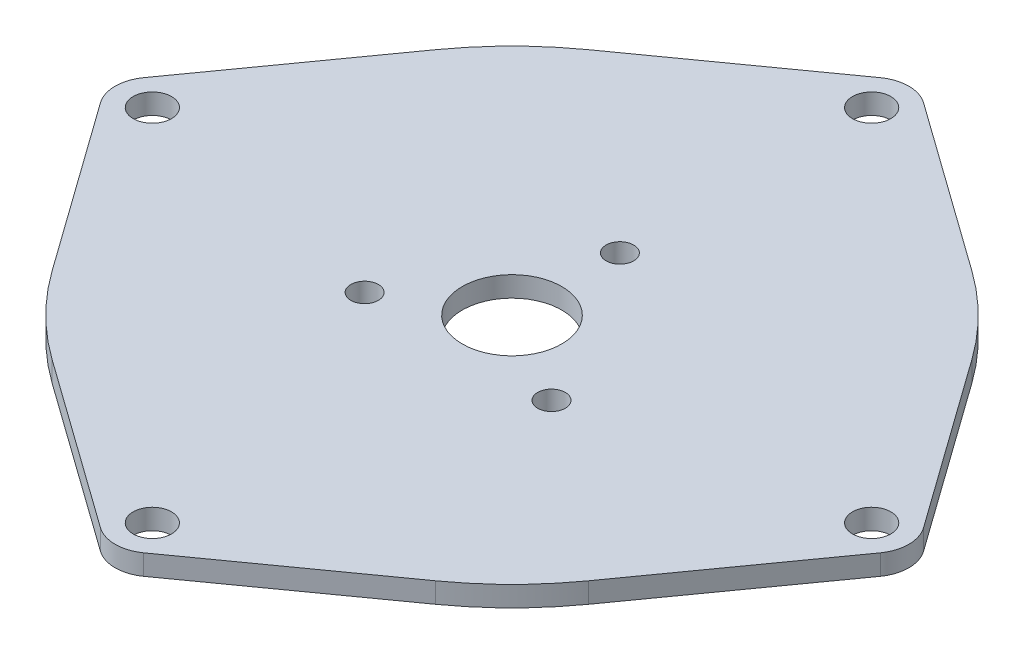
ISO-10303-21;
HEADER;
FILE_DESCRIPTION(('STEP AP214'),'2;1');
FILE_NAME('part.step','',(''),(''),'','','');
FILE_SCHEMA(('AUTOMOTIVE_DESIGN { 1 0 10303 214 1 1 1 1 }'));
ENDSEC;
DATA;
#1=APPLICATION_CONTEXT('core data for automotive mechanical design processes');
#2=APPLICATION_PROTOCOL_DEFINITION('international standard','automotive_design',2000,#1);
#3=PRODUCT_CONTEXT('',#1,'mechanical');
#4=PRODUCT('Part','Part','',(#3));
#5=PRODUCT_RELATED_PRODUCT_CATEGORY('part','',(#4));
#6=PRODUCT_DEFINITION_FORMATION('','',#4);
#7=PRODUCT_DEFINITION_CONTEXT('part definition',#1,'design');
#8=PRODUCT_DEFINITION('design','',#6,#7);
#9=PRODUCT_DEFINITION_SHAPE('','',#8);
#10=(LENGTH_UNIT() NAMED_UNIT(*) SI_UNIT(.MILLI.,.METRE.));
#11=(NAMED_UNIT(*) PLANE_ANGLE_UNIT() SI_UNIT($,.RADIAN.));
#12=(NAMED_UNIT(*) SI_UNIT($,.STERADIAN.) SOLID_ANGLE_UNIT());
#13=UNCERTAINTY_MEASURE_WITH_UNIT(LENGTH_MEASURE(1.E-05),#10,'distance_accuracy_value','');
#14=(GEOMETRIC_REPRESENTATION_CONTEXT(3) GLOBAL_UNCERTAINTY_ASSIGNED_CONTEXT((#13)) GLOBAL_UNIT_ASSIGNED_CONTEXT((#10,
#11,#12)) REPRESENTATION_CONTEXT('',''));
#15=CARTESIAN_POINT('',(0.,0.,0.));
#16=DIRECTION('',(0.,0.,1.));
#17=DIRECTION('',(1.,0.,0.));
#18=AXIS2_PLACEMENT_3D('',#15,#16,#17);
#19=CARTESIAN_POINT('',(15.9994444347971,1.7,-22.3666666666639));
#20=DIRECTION('',(0.581797979447238,0.,-0.813333333333334));
#21=DIRECTION('',(-0.813333333333334,0.,-0.581797979447238));
#22=AXIS2_PLACEMENT_3D('',#19,#20,#21);
#23=PLANE('',#22);
#24=DIRECTION('',(0.813333333333334,0.,0.581797979447238));
#25=VECTOR('',#24,1.);
#26=CARTESIAN_POINT('',(15.9994444347971,0.,-22.3666666666639));
#27=LINE('',#26,#25);
#28=CARTESIAN_POINT('',(1.8035737362858,0.,-32.5213333333296));
#29=VERTEX_POINT('',#28);
#30=CARTESIAN_POINT('',(15.9994444347994,0.,-22.3666666666643));
#31=VERTEX_POINT('',#30);
#32=EDGE_CURVE('E264',#29,#31,#27,.T.);
#33=ORIENTED_EDGE('',*,*,#32,.F.);
#34=DIRECTION('',(0.,-1.,0.));
#35=VECTOR('',#34,1.);
#36=CARTESIAN_POINT('',(1.8035737362858,1.7,-32.5213333333296));
#37=LINE('',#36,#35);
#38=CARTESIAN_POINT('',(1.8035737362858,1.7,-32.5213333333296));
#39=VERTEX_POINT('',#38);
#40=EDGE_CURVE('E11',#39,#29,#37,.T.);
#41=ORIENTED_EDGE('',*,*,#40,.F.);
#42=DIRECTION('',(0.813333333333334,0.,0.581797979447238));
#43=VECTOR('',#42,1.);
#44=CARTESIAN_POINT('',(15.9994444347971,1.7,-22.3666666666639));
#45=LINE('',#44,#43);
#46=CARTESIAN_POINT('',(15.9994444347994,1.7,-22.3666666666643));
#47=VERTEX_POINT('',#46);
#48=EDGE_CURVE('E410',#39,#47,#45,.T.);
#49=ORIENTED_EDGE('',*,*,#48,.T.);
#50=DIRECTION('',(0.,-1.,0.));
#51=VECTOR('',#50,1.);
#52=CARTESIAN_POINT('',(15.9994444347994,1.7,-22.3666666666643));
#53=LINE('',#52,#51);
#54=EDGE_CURVE('E145',#47,#31,#53,.T.);
#55=ORIENTED_EDGE('',*,*,#54,.T.);
#56=EDGE_LOOP('',(#33,#41,#49,#55));
#57=FACE_BOUND('',#56,.T.);
#58=ADVANCED_FACE('F51',(#57),#23,.T.);
#59=CARTESIAN_POINT('',(-6.33480808899767E-13,1.7,-29.9999999999963));
#60=DIRECTION('',(0.,-1.,0.));
#61=DIRECTION('',(0.,0.,-1.));
#62=AXIS2_PLACEMENT_3D('',#59,#60,#61);
#63=CYLINDRICAL_SURFACE('',#62,3.1);
#64=CARTESIAN_POINT('',(-6.33480808899767E-13,0.,-29.9999999999963));
#65=DIRECTION('',(0.,1.,0.));
#66=DIRECTION('',(0.,0.,1.));
#67=AXIS2_PLACEMENT_3D('',#64,#65,#66);
#68=CIRCLE('',#67,3.1);
#69=CARTESIAN_POINT('',(-1.80357373628707,0.,-32.5213333333296));
#70=VERTEX_POINT('',#69);
#71=EDGE_CURVE('E268',#29,#70,#68,.T.);
#72=ORIENTED_EDGE('',*,*,#71,.T.);
#73=DIRECTION('',(0.,-1.,0.));
#74=VECTOR('',#73,1.);
#75=CARTESIAN_POINT('',(-1.80357373628707,1.7,-32.5213333333296));
#76=LINE('',#75,#74);
#77=CARTESIAN_POINT('',(-1.80357373628707,1.7,-32.5213333333296));
#78=VERTEX_POINT('',#77);
#79=EDGE_CURVE('E61',#78,#70,#76,.T.);
#80=ORIENTED_EDGE('',*,*,#79,.F.);
#81=CARTESIAN_POINT('',(-6.33480808899767E-13,1.7,-29.9999999999963));
#82=DIRECTION('',(0.,1.,0.));
#83=DIRECTION('',(0.,0.,1.));
#84=AXIS2_PLACEMENT_3D('',#81,#82,#83);
#85=CIRCLE('',#84,3.1);
#86=EDGE_CURVE('E406',#39,#78,#85,.T.);
#87=ORIENTED_EDGE('',*,*,#86,.F.);
#88=ORIENTED_EDGE('',*,*,#40,.T.);
#89=EDGE_LOOP('',(#72,#80,#87,#88));
#90=FACE_BOUND('',#89,.T.);
#91=ADVANCED_FACE('F390',(#90),#63,.T.);
#92=CARTESIAN_POINT('',(-15.9994444347975,1.7,-22.3666666666645));
#93=DIRECTION('',(-0.581797979447239,0.,-0.813333333333333));
#94=DIRECTION('',(-0.813333333333333,0.,0.581797979447239));
#95=AXIS2_PLACEMENT_3D('',#92,#93,#94);
#96=PLANE('',#95);
#97=DIRECTION('',(0.813333333333333,0.,-0.581797979447239));
#98=VECTOR('',#97,1.);
#99=CARTESIAN_POINT('',(-15.9994444347975,0.,-22.3666666666645));
#100=LINE('',#99,#98);
#101=CARTESIAN_POINT('',(-15.9994444348004,0.,-22.366666666664));
#102=VERTEX_POINT('',#101);
#103=EDGE_CURVE('E272',#102,#70,#100,.T.);
#104=ORIENTED_EDGE('',*,*,#103,.F.);
#105=DIRECTION('',(0.,-1.,0.));
#106=VECTOR('',#105,1.);
#107=CARTESIAN_POINT('',(-15.9994444348004,1.7,-22.366666666664));
#108=LINE('',#107,#106);
#109=CARTESIAN_POINT('',(-15.9994444348004,1.7,-22.366666666664));
#110=VERTEX_POINT('',#109);
#111=EDGE_CURVE('E377',#110,#102,#108,.T.);
#112=ORIENTED_EDGE('',*,*,#111,.F.);
#113=DIRECTION('',(0.813333333333333,0.,-0.581797979447239));
#114=VECTOR('',#113,1.);
#115=CARTESIAN_POINT('',(-15.9994444347975,1.7,-22.3666666666645));
#116=LINE('',#115,#114);
#117=EDGE_CURVE('E387',#110,#78,#116,.T.);
#118=ORIENTED_EDGE('',*,*,#117,.T.);
#119=ORIENTED_EDGE('',*,*,#79,.T.);
#120=EDGE_LOOP('',(#104,#112,#118,#119));
#121=FACE_BOUND('',#120,.T.);
#122=ADVANCED_FACE('F385',(#121),#96,.T.);
#123=CARTESIAN_POINT('',(0.,1.7,0.));
#124=DIRECTION('',(0.,-1.,0.));
#125=DIRECTION('',(0.,0.,-1.));
#126=AXIS2_PLACEMENT_3D('',#123,#124,#125);
#127=CYLINDRICAL_SURFACE('',#126,27.5);
#128=CARTESIAN_POINT('',(0.,0.,0.));
#129=DIRECTION('',(0.,1.,0.));
#130=DIRECTION('',(0.,0.,1.));
#131=AXIS2_PLACEMENT_3D('',#128,#129,#130);
#132=CIRCLE('',#131,27.5);
#133=CARTESIAN_POINT('',(-22.3666666666656,0.,-15.9994444347962));
#134=VERTEX_POINT('',#133);
#135=EDGE_CURVE('E276',#102,#134,#132,.T.);
#136=ORIENTED_EDGE('',*,*,#135,.T.);
#137=DIRECTION('',(0.,-1.,0.));
#138=VECTOR('',#137,1.);
#139=CARTESIAN_POINT('',(-22.3666666666656,1.7,-15.9994444347962));
#140=LINE('',#139,#138);
#141=CARTESIAN_POINT('',(-22.3666666666656,1.7,-15.9994444347962));
#142=VERTEX_POINT('',#141);
#143=EDGE_CURVE('E374',#142,#134,#140,.T.);
#144=ORIENTED_EDGE('',*,*,#143,.F.);
#145=CARTESIAN_POINT('',(0.,1.7,0.));
#146=DIRECTION('',(0.,1.,0.));
#147=DIRECTION('',(0.,0.,1.));
#148=AXIS2_PLACEMENT_3D('',#145,#146,#147);
#149=CIRCLE('',#148,27.5);
#150=EDGE_CURVE('E230',#110,#142,#149,.T.);
#151=ORIENTED_EDGE('',*,*,#150,.F.);
#152=ORIENTED_EDGE('',*,*,#111,.T.);
#153=EDGE_LOOP('',(#136,#144,#151,#152));
#154=FACE_BOUND('',#153,.T.);
#155=ADVANCED_FACE('F399',(#154),#127,.T.);
#156=CARTESIAN_POINT('',(-22.3666666666626,1.7,-15.9994444347961));
#157=DIRECTION('',(-0.813333333333334,0.,-0.581797979447238));
#158=DIRECTION('',(-0.581797979447238,0.,0.813333333333334));
#159=AXIS2_PLACEMENT_3D('',#156,#157,#158);
#160=PLANE('',#159);
#161=DIRECTION('',(0.581797979447238,0.,-0.813333333333334));
#162=VECTOR('',#161,1.);
#163=CARTESIAN_POINT('',(-22.3666666666626,0.,-15.9994444347961));
#164=LINE('',#163,#162);
#165=CARTESIAN_POINT('',(-32.5213333333302,0.,-1.80357373628208));
#166=VERTEX_POINT('',#165);
#167=EDGE_CURVE('E280',#166,#134,#164,.T.);
#168=ORIENTED_EDGE('',*,*,#167,.F.);
#169=DIRECTION('',(0.,-1.,0.));
#170=VECTOR('',#169,1.);
#171=CARTESIAN_POINT('',(-32.5213333333302,1.7,-1.80357373628208));
#172=LINE('',#171,#170);
#173=CARTESIAN_POINT('',(-32.5213333333302,1.7,-1.80357373628208));
#174=VERTEX_POINT('',#173);
#175=EDGE_CURVE('E371',#174,#166,#172,.T.);
#176=ORIENTED_EDGE('',*,*,#175,.F.);
#177=DIRECTION('',(0.581797979447238,0.,-0.813333333333334));
#178=VECTOR('',#177,1.);
#179=CARTESIAN_POINT('',(-22.3666666666626,1.7,-15.9994444347961));
#180=LINE('',#179,#178);
#181=EDGE_CURVE('E404',#174,#142,#180,.T.);
#182=ORIENTED_EDGE('',*,*,#181,.T.);
#183=ORIENTED_EDGE('',*,*,#143,.T.);
#184=EDGE_LOOP('',(#168,#176,#182,#183));
#185=FACE_BOUND('',#184,.T.);
#186=ADVANCED_FACE('F494',(#185),#160,.T.);
#187=CARTESIAN_POINT('',(-29.9999999999969,1.7,4.35436041814727E-12));
#188=DIRECTION('',(0.,-1.,0.));
#189=DIRECTION('',(0.,0.,-1.));
#190=AXIS2_PLACEMENT_3D('',#187,#188,#189);
#191=CYLINDRICAL_SURFACE('',#190,3.1);
#192=CARTESIAN_POINT('',(-29.9999999999969,0.,4.35436041814727E-12));
#193=DIRECTION('',(0.,1.,0.));
#194=DIRECTION('',(0.,0.,1.));
#195=AXIS2_PLACEMENT_3D('',#192,#193,#194);
#196=CIRCLE('',#195,3.1);
#197=CARTESIAN_POINT('',(-32.5213333333302,0.,1.80357373629079));
#198=VERTEX_POINT('',#197);
#199=EDGE_CURVE('E286',#166,#198,#196,.T.);
#200=ORIENTED_EDGE('',*,*,#199,.T.);
#201=DIRECTION('',(0.,-1.,0.));
#202=VECTOR('',#201,1.);
#203=CARTESIAN_POINT('',(-32.5213333333302,1.7,1.80357373629079));
#204=LINE('',#203,#202);
#205=CARTESIAN_POINT('',(-32.5213333333302,1.7,1.80357373629079));
#206=VERTEX_POINT('',#205);
#207=EDGE_CURVE('E368',#206,#198,#204,.T.);
#208=ORIENTED_EDGE('',*,*,#207,.F.);
#209=CARTESIAN_POINT('',(-29.9999999999969,1.7,4.35436041814727E-12));
#210=DIRECTION('',(0.,1.,0.));
#211=DIRECTION('',(0.,0.,1.));
#212=AXIS2_PLACEMENT_3D('',#209,#210,#211);
#213=CIRCLE('',#212,3.1);
#214=EDGE_CURVE('E416',#174,#206,#213,.T.);
#215=ORIENTED_EDGE('',*,*,#214,.F.);
#216=ORIENTED_EDGE('',*,*,#175,.T.);
#217=EDGE_LOOP('',(#200,#208,#215,#216));
#218=FACE_BOUND('',#217,.T.);
#219=ADVANCED_FACE('F497',(#218),#191,.T.);
#220=CARTESIAN_POINT('',(-22.3666666666667,1.7,15.9994444347991));
#221=DIRECTION('',(-0.813333333333333,0.,0.581797979447239));
#222=DIRECTION('',(0.581797979447239,0.,0.813333333333333));
#223=AXIS2_PLACEMENT_3D('',#220,#221,#222);
#224=PLANE('',#223);
#225=DIRECTION('',(-0.581797979447239,0.,-0.813333333333333));
#226=VECTOR('',#225,1.);
#227=CARTESIAN_POINT('',(-22.3666666666667,0.,15.9994444347991));
#228=LINE('',#227,#226);
#229=CARTESIAN_POINT('',(-22.3666666666636,0.,15.9994444348034));
#230=VERTEX_POINT('',#229);
#231=EDGE_CURVE('E290',#230,#198,#228,.T.);
#232=ORIENTED_EDGE('',*,*,#231,.F.);
#233=DIRECTION('',(0.,-1.,0.));
#234=VECTOR('',#233,1.);
#235=CARTESIAN_POINT('',(-22.3666666666636,1.7,15.9994444348034));
#236=LINE('',#235,#234);
#237=CARTESIAN_POINT('',(-22.3666666666636,1.7,15.9994444348034));
#238=VERTEX_POINT('',#237);
#239=EDGE_CURVE('E365',#238,#230,#236,.T.);
#240=ORIENTED_EDGE('',*,*,#239,.F.);
#241=DIRECTION('',(-0.581797979447239,0.,-0.813333333333333));
#242=VECTOR('',#241,1.);
#243=CARTESIAN_POINT('',(-22.3666666666667,1.7,15.9994444347991));
#244=LINE('',#243,#242);
#245=EDGE_CURVE('E419',#238,#206,#244,.T.);
#246=ORIENTED_EDGE('',*,*,#245,.T.);
#247=ORIENTED_EDGE('',*,*,#207,.T.);
#248=EDGE_LOOP('',(#232,#240,#246,#247));
#249=FACE_BOUND('',#248,.T.);
#250=ADVANCED_FACE('F501',(#249),#224,.T.);
#251=CARTESIAN_POINT('',(-15.9994444347958,0.,22.366666666668));
#252=VERTEX_POINT('',#251);
#253=EDGE_CURVE('E282',#230,#252,#132,.T.);
#254=ORIENTED_EDGE('',*,*,#253,.T.);
#255=DIRECTION('',(0.,-1.,0.));
#256=VECTOR('',#255,1.);
#257=CARTESIAN_POINT('',(-15.9994444347958,1.7,22.366666666668));
#258=LINE('',#257,#256);
#259=CARTESIAN_POINT('',(-15.9994444347958,1.7,22.366666666668));
#260=VERTEX_POINT('',#259);
#261=EDGE_CURVE('E362',#260,#252,#258,.T.);
#262=ORIENTED_EDGE('',*,*,#261,.F.);
#263=EDGE_CURVE('E405',#238,#260,#149,.T.);
#264=ORIENTED_EDGE('',*,*,#263,.F.);
#265=ORIENTED_EDGE('',*,*,#239,.T.);
#266=EDGE_LOOP('',(#254,#262,#264,#265));
#267=FACE_BOUND('',#266,.T.);
#268=ADVANCED_FACE('F447',(#267),#127,.T.);
#269=CARTESIAN_POINT('',(-15.9994444347981,1.7,22.3666666666653));
#270=DIRECTION('',(-0.581797979447238,0.,0.813333333333334));
#271=DIRECTION('',(0.813333333333334,0.,0.581797979447238));
#272=AXIS2_PLACEMENT_3D('',#269,#270,#271);
#273=PLANE('',#272);
#274=DIRECTION('',(-0.813333333333334,0.,-0.581797979447238));
#275=VECTOR('',#274,1.);
#276=CARTESIAN_POINT('',(-15.9994444347981,0.,22.3666666666653));
#277=LINE('',#276,#275);
#278=CARTESIAN_POINT('',(-1.80357373628271,0.,32.521333333334));
#279=VERTEX_POINT('',#278);
#280=EDGE_CURVE('E294',#279,#252,#277,.T.);
#281=ORIENTED_EDGE('',*,*,#280,.F.);
#282=DIRECTION('',(0.,-1.,0.));
#283=VECTOR('',#282,1.);
#284=CARTESIAN_POINT('',(-1.80357373628271,1.7,32.521333333334));
#285=LINE('',#284,#283);
#286=CARTESIAN_POINT('',(-1.80357373628271,1.7,32.521333333334));
#287=VERTEX_POINT('',#286);
#288=EDGE_CURVE('E359',#287,#279,#285,.T.);
#289=ORIENTED_EDGE('',*,*,#288,.F.);
#290=DIRECTION('',(-0.813333333333334,0.,-0.581797979447238));
#291=VECTOR('',#290,1.);
#292=CARTESIAN_POINT('',(-15.9994444347981,1.7,22.3666666666653));
#293=LINE('',#292,#291);
#294=EDGE_CURVE('E423',#287,#260,#293,.T.);
#295=ORIENTED_EDGE('',*,*,#294,.T.);
#296=ORIENTED_EDGE('',*,*,#261,.T.);
#297=EDGE_LOOP('',(#281,#289,#295,#296));
#298=FACE_BOUND('',#297,.T.);
#299=ADVANCED_FACE('F451',(#298),#273,.T.);
#300=CARTESIAN_POINT('',(3.72455354964495E-12,1.7,30.0000000000006));
#301=DIRECTION('',(0.,-1.,0.));
#302=DIRECTION('',(0.,0.,-1.));
#303=AXIS2_PLACEMENT_3D('',#300,#301,#302);
#304=CYLINDRICAL_SURFACE('',#303,3.1);
#305=CARTESIAN_POINT('',(3.72455354964495E-12,0.,30.0000000000006));
#306=DIRECTION('',(0.,1.,0.));
#307=DIRECTION('',(0.,0.,1.));
#308=AXIS2_PLACEMENT_3D('',#305,#306,#307);
#309=CIRCLE('',#308,3.1);
#310=CARTESIAN_POINT('',(1.80357373629016,0.,32.521333333334));
#311=VERTEX_POINT('',#310);
#312=EDGE_CURVE('E298',#279,#311,#309,.T.);
#313=ORIENTED_EDGE('',*,*,#312,.T.);
#314=DIRECTION('',(0.,-1.,0.));
#315=VECTOR('',#314,1.);
#316=CARTESIAN_POINT('',(1.80357373629016,1.7,32.521333333334));
#317=LINE('',#316,#315);
#318=CARTESIAN_POINT('',(1.80357373629016,1.7,32.521333333334));
#319=VERTEX_POINT('',#318);
#320=EDGE_CURVE('E356',#319,#311,#317,.T.);
#321=ORIENTED_EDGE('',*,*,#320,.F.);
#322=CARTESIAN_POINT('',(3.72455354964495E-12,1.7,30.0000000000006));
#323=DIRECTION('',(0.,1.,0.));
#324=DIRECTION('',(0.,0.,1.));
#325=AXIS2_PLACEMENT_3D('',#322,#323,#324);
#326=CIRCLE('',#325,3.1);
#327=EDGE_CURVE('E427',#287,#319,#326,.T.);
#328=ORIENTED_EDGE('',*,*,#327,.F.);
#329=ORIENTED_EDGE('',*,*,#288,.T.);
#330=EDGE_LOOP('',(#313,#321,#328,#329));
#331=FACE_BOUND('',#330,.T.);
#332=ADVANCED_FACE('F456',(#331),#304,.T.);
#333=CARTESIAN_POINT('',(15.9994444348006,1.7,22.3666666666688));
#334=DIRECTION('',(0.581797979447238,0.,0.813333333333333));
#335=DIRECTION('',(0.813333333333333,0.,-0.581797979447239));
#336=AXIS2_PLACEMENT_3D('',#333,#334,#335);
#337=PLANE('',#336);
#338=DIRECTION('',(-0.813333333333333,0.,0.581797979447238));
#339=VECTOR('',#338,1.);
#340=CARTESIAN_POINT('',(15.9994444348006,0.,22.3666666666688));
#341=LINE('',#340,#339);
#342=CARTESIAN_POINT('',(15.999444434802,0.,22.3666666666662));
#343=VERTEX_POINT('',#342);
#344=EDGE_CURVE('E302',#343,#311,#341,.T.);
#345=ORIENTED_EDGE('',*,*,#344,.F.);
#346=DIRECTION('',(0.,-1.,0.));
#347=VECTOR('',#346,1.);
#348=CARTESIAN_POINT('',(15.999444434802,1.7,22.3666666666662));
#349=LINE('',#348,#347);
#350=CARTESIAN_POINT('',(15.999444434802,1.7,22.3666666666662));
#351=VERTEX_POINT('',#350);
#352=EDGE_CURVE('E353',#351,#343,#349,.T.);
#353=ORIENTED_EDGE('',*,*,#352,.F.);
#354=DIRECTION('',(-0.813333333333333,0.,0.581797979447238));
#355=VECTOR('',#354,1.);
#356=CARTESIAN_POINT('',(15.9994444348006,1.7,22.3666666666688));
#357=LINE('',#356,#355);
#358=EDGE_CURVE('E430',#351,#319,#357,.T.);
#359=ORIENTED_EDGE('',*,*,#358,.T.);
#360=ORIENTED_EDGE('',*,*,#320,.T.);
#361=EDGE_LOOP('',(#345,#353,#359,#360));
#362=FACE_BOUND('',#361,.T.);
#363=ADVANCED_FACE('F459',(#362),#337,.T.);
#364=CARTESIAN_POINT('',(22.3666666666667,0.,15.999444434799));
#365=VERTEX_POINT('',#364);
#366=EDGE_CURVE('E306',#343,#365,#132,.T.);
#367=ORIENTED_EDGE('',*,*,#366,.T.);
#368=DIRECTION('',(0.,-1.,0.));
#369=VECTOR('',#368,1.);
#370=CARTESIAN_POINT('',(22.3666666666667,1.7,15.999444434799));
#371=LINE('',#370,#369);
#372=CARTESIAN_POINT('',(22.3666666666667,1.7,15.999444434799));
#373=VERTEX_POINT('',#372);
#374=EDGE_CURVE('E350',#373,#365,#371,.T.);
#375=ORIENTED_EDGE('',*,*,#374,.F.);
#376=EDGE_CURVE('E229',#351,#373,#149,.T.);
#377=ORIENTED_EDGE('',*,*,#376,.F.);
#378=ORIENTED_EDGE('',*,*,#352,.T.);
#379=EDGE_LOOP('',(#367,#375,#377,#378));
#380=FACE_BOUND('',#379,.T.);
#381=ADVANCED_FACE('F463',(#380),#127,.T.);
#382=CARTESIAN_POINT('',(22.3666666666667,1.7,15.9994444347991));
#383=DIRECTION('',(0.813333333333333,0.,0.581797979447238));
#384=DIRECTION('',(0.581797979447239,0.,-0.813333333333333));
#385=AXIS2_PLACEMENT_3D('',#382,#383,#384);
#386=PLANE('',#385);
#387=DIRECTION('',(-0.581797979447238,0.,0.813333333333333));
#388=VECTOR('',#387,1.);
#389=CARTESIAN_POINT('',(22.3666666666667,0.,15.9994444347991));
#390=LINE('',#389,#388);
#391=CARTESIAN_POINT('',(32.5213333333333,0.,1.80357373628644));
#392=VERTEX_POINT('',#391);
#393=EDGE_CURVE('E307',#392,#365,#390,.T.);
#394=ORIENTED_EDGE('',*,*,#393,.F.);
#395=DIRECTION('',(0.,-1.,0.));
#396=VECTOR('',#395,1.);
#397=CARTESIAN_POINT('',(32.5213333333333,1.7,1.80357373628644));
#398=LINE('',#397,#396);
#399=CARTESIAN_POINT('',(32.5213333333333,1.7,1.80357373628644));
#400=VERTEX_POINT('',#399);
#401=EDGE_CURVE('E220',#400,#392,#398,.T.);
#402=ORIENTED_EDGE('',*,*,#401,.F.);
#403=DIRECTION('',(-0.581797979447238,0.,0.813333333333333));
#404=VECTOR('',#403,1.);
#405=CARTESIAN_POINT('',(22.3666666666667,1.7,15.9994444347991));
#406=LINE('',#405,#404);
#407=EDGE_CURVE('E207',#400,#373,#406,.T.);
#408=ORIENTED_EDGE('',*,*,#407,.T.);
#409=ORIENTED_EDGE('',*,*,#374,.T.);
#410=EDGE_LOOP('',(#394,#402,#408,#409));
#411=FACE_BOUND('',#410,.T.);
#412=ADVANCED_FACE('F465',(#411),#386,.T.);
#413=CARTESIAN_POINT('',(30.,1.7,0.));
#414=DIRECTION('',(0.,-1.,0.));
#415=DIRECTION('',(0.,0.,-1.));
#416=AXIS2_PLACEMENT_3D('',#413,#414,#415);
#417=CYLINDRICAL_SURFACE('',#416,3.1);
#418=CARTESIAN_POINT('',(30.,0.,0.));
#419=DIRECTION('',(0.,1.,0.));
#420=DIRECTION('',(0.,0.,1.));
#421=AXIS2_PLACEMENT_3D('',#418,#419,#420);
#422=CIRCLE('',#421,3.1);
#423=CARTESIAN_POINT('',(32.5213333333333,0.,-1.80357373628644));
#424=VERTEX_POINT('',#423);
#425=EDGE_CURVE('E215',#392,#424,#422,.T.);
#426=ORIENTED_EDGE('',*,*,#425,.T.);
#427=DIRECTION('',(0.,-1.,0.));
#428=VECTOR('',#427,1.);
#429=CARTESIAN_POINT('',(32.5213333333333,1.7,-1.80357373628644));
#430=LINE('',#429,#428);
#431=CARTESIAN_POINT('',(32.5213333333333,1.7,-1.80357373628644));
#432=VERTEX_POINT('',#431);
#433=EDGE_CURVE('E212',#432,#424,#430,.T.);
#434=ORIENTED_EDGE('',*,*,#433,.F.);
#435=CARTESIAN_POINT('',(30.,1.7,0.));
#436=DIRECTION('',(0.,1.,0.));
#437=DIRECTION('',(0.,0.,1.));
#438=AXIS2_PLACEMENT_3D('',#435,#436,#437);
#439=CIRCLE('',#438,3.1);
#440=EDGE_CURVE('E200',#400,#432,#439,.T.);
#441=ORIENTED_EDGE('',*,*,#440,.F.);
#442=ORIENTED_EDGE('',*,*,#401,.T.);
#443=EDGE_LOOP('',(#426,#434,#441,#442));
#444=FACE_BOUND('',#443,.T.);
#445=ADVANCED_FACE('F213',(#444),#417,.T.);
#446=CARTESIAN_POINT('',(22.3666666666667,1.7,-15.999444434799));
#447=DIRECTION('',(0.813333333333333,0.,-0.581797979447238));
#448=DIRECTION('',(-0.581797979447238,0.,-0.813333333333333));
#449=AXIS2_PLACEMENT_3D('',#446,#447,#448);
#450=PLANE('',#449);
#451=DIRECTION('',(0.581797979447238,0.,0.813333333333333));
#452=VECTOR('',#451,1.);
#453=CARTESIAN_POINT('',(22.3666666666667,0.,-15.999444434799));
#454=LINE('',#453,#452);
#455=CARTESIAN_POINT('',(22.3666666666667,0.,-15.9994444347991));
#456=VERTEX_POINT('',#455);
#457=EDGE_CURVE('E313',#456,#424,#454,.T.);
#458=ORIENTED_EDGE('',*,*,#457,.F.);
#459=DIRECTION('',(0.,-1.,0.));
#460=VECTOR('',#459,1.);
#461=CARTESIAN_POINT('',(22.3666666666667,1.7,-15.9994444347991));
#462=LINE('',#461,#460);
#463=CARTESIAN_POINT('',(22.3666666666667,1.7,-15.9994444347991));
#464=VERTEX_POINT('',#463);
#465=EDGE_CURVE('E138',#464,#456,#462,.T.);
#466=ORIENTED_EDGE('',*,*,#465,.F.);
#467=DIRECTION('',(0.581797979447238,0.,0.813333333333333));
#468=VECTOR('',#467,1.);
#469=CARTESIAN_POINT('',(22.3666666666667,1.7,-15.999444434799));
#470=LINE('',#469,#468);
#471=EDGE_CURVE('E205',#464,#432,#470,.T.);
#472=ORIENTED_EDGE('',*,*,#471,.T.);
#473=ORIENTED_EDGE('',*,*,#433,.T.);
#474=EDGE_LOOP('',(#458,#466,#472,#473));
#475=FACE_BOUND('',#474,.T.);
#476=ADVANCED_FACE('F222',(#475),#450,.T.);
#477=CARTESIAN_POINT('',(3.72455354964495E-12,1.7,30.0000000000006));
#478=DIRECTION('',(0.,-1.,0.));
#479=DIRECTION('',(0.,0.,-1.));
#480=AXIS2_PLACEMENT_3D('',#477,#478,#479);
#481=CYLINDRICAL_SURFACE('',#480,1.59999999999828);
#482=CARTESIAN_POINT('',(3.72455354964495E-12,1.7,30.0000000000006));
#483=DIRECTION('',(0.,1.,0.));
#484=DIRECTION('',(0.,0.,1.));
#485=AXIS2_PLACEMENT_3D('',#482,#483,#484);
#486=CIRCLE('',#485,1.59999999999828);
#487=CARTESIAN_POINT('',(3.72455354964495E-12,1.7,31.5999999999989));
#488=VERTEX_POINT('',#487);
#489=EDGE_CURVE('E252',#488,#488,#486,.T.);
#490=ORIENTED_EDGE('',*,*,#489,.T.);
#491=EDGE_LOOP('',(#490));
#492=FACE_BOUND('',#491,.T.);
#493=CARTESIAN_POINT('',(3.72455354964495E-12,0.,30.0000000000006));
#494=DIRECTION('',(0.,1.,0.));
#495=DIRECTION('',(0.,0.,1.));
#496=AXIS2_PLACEMENT_3D('',#493,#494,#495);
#497=CIRCLE('',#496,1.59999999999828);
#498=CARTESIAN_POINT('',(3.72455354964495E-12,0.,31.5999999999989));
#499=VERTEX_POINT('',#498);
#500=EDGE_CURVE('E336',#499,#499,#497,.T.);
#501=ORIENTED_EDGE('',*,*,#500,.F.);
#502=EDGE_LOOP('',(#501));
#503=FACE_BOUND('',#502,.T.);
#504=ADVANCED_FACE('F518',(#492,#503),#481,.F.);
#505=CARTESIAN_POINT('',(30.,1.7,0.));
#506=DIRECTION('',(0.,-1.,0.));
#507=DIRECTION('',(0.,0.,-1.));
#508=AXIS2_PLACEMENT_3D('',#505,#506,#507);
#509=CYLINDRICAL_SURFACE('',#508,1.60000000000001);
#510=CARTESIAN_POINT('',(30.,1.7,0.));
#511=DIRECTION('',(0.,1.,0.));
#512=DIRECTION('',(0.,0.,1.));
#513=AXIS2_PLACEMENT_3D('',#510,#511,#512);
#514=CIRCLE('',#513,1.60000000000001);
#515=CARTESIAN_POINT('',(30.,1.7,1.60000000000001));
#516=VERTEX_POINT('',#515);
#517=EDGE_CURVE('E248',#516,#516,#514,.T.);
#518=ORIENTED_EDGE('',*,*,#517,.T.);
#519=EDGE_LOOP('',(#518));
#520=FACE_BOUND('',#519,.T.);
#521=CARTESIAN_POINT('',(30.,0.,0.));
#522=DIRECTION('',(0.,1.,0.));
#523=DIRECTION('',(0.,0.,1.));
#524=AXIS2_PLACEMENT_3D('',#521,#522,#523);
#525=CIRCLE('',#524,1.60000000000001);
#526=CARTESIAN_POINT('',(30.,0.,1.60000000000001));
#527=VERTEX_POINT('',#526);
#528=EDGE_CURVE('E332',#527,#527,#525,.T.);
#529=ORIENTED_EDGE('',*,*,#528,.F.);
#530=EDGE_LOOP('',(#529));
#531=FACE_BOUND('',#530,.T.);
#532=ADVANCED_FACE('F536',(#520,#531),#509,.F.);
#533=CARTESIAN_POINT('',(0.,1.7,-9.));
#534=DIRECTION('',(0.,-1.,0.));
#535=DIRECTION('',(0.,0.,-1.));
#536=AXIS2_PLACEMENT_3D('',#533,#534,#535);
#537=CYLINDRICAL_SURFACE('',#536,1.15);
#538=CARTESIAN_POINT('',(0.,1.7,-9.));
#539=DIRECTION('',(0.,1.,0.));
#540=DIRECTION('',(0.,0.,1.));
#541=AXIS2_PLACEMENT_3D('',#538,#539,#540);
#542=CIRCLE('',#541,1.15);
#543=CARTESIAN_POINT('',(0.,1.7,-7.85));
#544=VERTEX_POINT('',#543);
#545=EDGE_CURVE('E244',#544,#544,#542,.T.);
#546=ORIENTED_EDGE('',*,*,#545,.T.);
#547=EDGE_LOOP('',(#546));
#548=FACE_BOUND('',#547,.T.);
#549=CARTESIAN_POINT('',(0.,0.,-9.));
#550=DIRECTION('',(0.,1.,0.));
#551=DIRECTION('',(0.,0.,1.));
#552=AXIS2_PLACEMENT_3D('',#549,#550,#551);
#553=CIRCLE('',#552,1.15);
#554=CARTESIAN_POINT('',(0.,0.,-7.85));
#555=VERTEX_POINT('',#554);
#556=EDGE_CURVE('E328',#555,#555,#553,.T.);
#557=ORIENTED_EDGE('',*,*,#556,.F.);
#558=EDGE_LOOP('',(#557));
#559=FACE_BOUND('',#558,.T.);
#560=ADVANCED_FACE('F532',(#548,#559),#537,.F.);
#561=CARTESIAN_POINT('',(7.79422863405993,1.7,4.50000000000004));
#562=DIRECTION('',(0.,-1.,0.));
#563=DIRECTION('',(0.,0.,-1.));
#564=AXIS2_PLACEMENT_3D('',#561,#562,#563);
#565=CYLINDRICAL_SURFACE('',#564,1.15);
#566=CARTESIAN_POINT('',(7.79422863405993,1.7,4.50000000000004));
#567=DIRECTION('',(0.,1.,0.));
#568=DIRECTION('',(0.,0.,1.));
#569=AXIS2_PLACEMENT_3D('',#566,#567,#568);
#570=CIRCLE('',#569,1.15);
#571=CARTESIAN_POINT('',(7.79422863405993,1.7,5.65000000000004));
#572=VERTEX_POINT('',#571);
#573=EDGE_CURVE('E240',#572,#572,#570,.T.);
#574=ORIENTED_EDGE('',*,*,#573,.T.);
#575=EDGE_LOOP('',(#574));
#576=FACE_BOUND('',#575,.T.);
#577=CARTESIAN_POINT('',(7.79422863405993,0.,4.50000000000004));
#578=DIRECTION('',(0.,1.,0.));
#579=DIRECTION('',(0.,0.,1.));
#580=AXIS2_PLACEMENT_3D('',#577,#578,#579);
#581=CIRCLE('',#580,1.15);
#582=CARTESIAN_POINT('',(7.79422863405993,0.,5.65000000000004));
#583=VERTEX_POINT('',#582);
#584=EDGE_CURVE('E324',#583,#583,#581,.T.);
#585=ORIENTED_EDGE('',*,*,#584,.F.);
#586=EDGE_LOOP('',(#585));
#587=FACE_BOUND('',#586,.T.);
#588=ADVANCED_FACE('F528',(#576,#587),#565,.F.);
#589=CARTESIAN_POINT('',(-7.79422863405999,1.7,4.49999999999993));
#590=DIRECTION('',(0.,-1.,0.));
#591=DIRECTION('',(0.,0.,-1.));
#592=AXIS2_PLACEMENT_3D('',#589,#590,#591);
#593=CYLINDRICAL_SURFACE('',#592,1.15);
#594=CARTESIAN_POINT('',(-7.79422863405999,1.7,4.49999999999993));
#595=DIRECTION('',(0.,1.,0.));
#596=DIRECTION('',(0.,0.,1.));
#597=AXIS2_PLACEMENT_3D('',#594,#595,#596);
#598=CIRCLE('',#597,1.15);
#599=CARTESIAN_POINT('',(-7.79422863405999,1.7,5.64999999999993));
#600=VERTEX_POINT('',#599);
#601=EDGE_CURVE('E236',#600,#600,#598,.T.);
#602=ORIENTED_EDGE('',*,*,#601,.T.);
#603=EDGE_LOOP('',(#602));
#604=FACE_BOUND('',#603,.T.);
#605=CARTESIAN_POINT('',(-7.79422863405999,0.,4.49999999999993));
#606=DIRECTION('',(0.,1.,0.));
#607=DIRECTION('',(0.,0.,1.));
#608=AXIS2_PLACEMENT_3D('',#605,#606,#607);
#609=CIRCLE('',#608,1.15);
#610=CARTESIAN_POINT('',(-7.79422863405999,0.,5.64999999999993));
#611=VERTEX_POINT('',#610);
#612=EDGE_CURVE('E320',#611,#611,#609,.T.);
#613=ORIENTED_EDGE('',*,*,#612,.F.);
#614=EDGE_LOOP('',(#613));
#615=FACE_BOUND('',#614,.T.);
#616=ADVANCED_FACE('F524',(#604,#615),#593,.F.);
#617=CARTESIAN_POINT('',(0.,1.7,0.));
#618=DIRECTION('',(0.,-1.,0.));
#619=DIRECTION('',(0.,0.,-1.));
#620=AXIS2_PLACEMENT_3D('',#617,#618,#619);
#621=CYLINDRICAL_SURFACE('',#620,4.15);
#622=CARTESIAN_POINT('',(0.,1.7,0.));
#623=DIRECTION('',(0.,1.,0.));
#624=DIRECTION('',(0.,0.,1.));
#625=AXIS2_PLACEMENT_3D('',#622,#623,#624);
#626=CIRCLE('',#625,4.15);
#627=CARTESIAN_POINT('',(0.,1.7,4.15));
#628=VERTEX_POINT('',#627);
#629=EDGE_CURVE('E227',#628,#628,#626,.T.);
#630=ORIENTED_EDGE('',*,*,#629,.T.);
#631=EDGE_LOOP('',(#630));
#632=FACE_BOUND('',#631,.T.);
#633=CARTESIAN_POINT('',(0.,0.,0.));
#634=DIRECTION('',(0.,1.,0.));
#635=DIRECTION('',(0.,0.,1.));
#636=AXIS2_PLACEMENT_3D('',#633,#634,#635);
#637=CIRCLE('',#636,4.15);
#638=CARTESIAN_POINT('',(0.,0.,4.15));
#639=VERTEX_POINT('',#638);
#640=EDGE_CURVE('E316',#639,#639,#637,.T.);
#641=ORIENTED_EDGE('',*,*,#640,.F.);
#642=EDGE_LOOP('',(#641));
#643=FACE_BOUND('',#642,.T.);
#644=ADVANCED_FACE('F521',(#632,#643),#621,.F.);
#645=EDGE_CURVE('E281',#456,#31,#132,.T.);
#646=ORIENTED_EDGE('',*,*,#645,.T.);
#647=ORIENTED_EDGE('',*,*,#54,.F.);
#648=EDGE_CURVE('E72',#464,#47,#149,.T.);
#649=ORIENTED_EDGE('',*,*,#648,.F.);
#650=ORIENTED_EDGE('',*,*,#465,.T.);
#651=EDGE_LOOP('',(#646,#647,#649,#650));
#652=FACE_BOUND('',#651,.T.);
#653=ADVANCED_FACE('F468',(#652),#127,.T.);
#654=CARTESIAN_POINT('',(-6.33480808899767E-13,1.7,-29.9999999999963));
#655=DIRECTION('',(0.,-1.,0.));
#656=DIRECTION('',(0.,0.,-1.));
#657=AXIS2_PLACEMENT_3D('',#654,#655,#656);
#658=CYLINDRICAL_SURFACE('',#657,1.60000000000329);
#659=CARTESIAN_POINT('',(-6.33480808899767E-13,1.7,-29.9999999999963));
#660=DIRECTION('',(0.,1.,0.));
#661=DIRECTION('',(0.,0.,1.));
#662=AXIS2_PLACEMENT_3D('',#659,#660,#661);
#663=CIRCLE('',#662,1.60000000000329);
#664=CARTESIAN_POINT('',(-6.33480808899767E-13,1.7,-28.399999999993));
#665=VERTEX_POINT('',#664);
#666=EDGE_CURVE('E344',#665,#665,#663,.T.);
#667=ORIENTED_EDGE('',*,*,#666,.T.);
#668=EDGE_LOOP('',(#667));
#669=FACE_BOUND('',#668,.T.);
#670=CARTESIAN_POINT('',(-6.33480808899767E-13,0.,-29.9999999999963));
#671=DIRECTION('',(0.,1.,0.));
#672=DIRECTION('',(0.,0.,1.));
#673=AXIS2_PLACEMENT_3D('',#670,#671,#672);
#674=CIRCLE('',#673,1.60000000000329);
#675=CARTESIAN_POINT('',(-6.33480808899767E-13,0.,-28.399999999993));
#676=VERTEX_POINT('',#675);
#677=EDGE_CURVE('E260',#676,#676,#674,.T.);
#678=ORIENTED_EDGE('',*,*,#677,.F.);
#679=EDGE_LOOP('',(#678));
#680=FACE_BOUND('',#679,.T.);
#681=ADVANCED_FACE('F53',(#669,#680),#658,.F.);
#682=CARTESIAN_POINT('',(-29.9999999999969,1.7,4.35436041814727E-12));
#683=DIRECTION('',(0.,-1.,0.));
#684=DIRECTION('',(0.,0.,-1.));
#685=AXIS2_PLACEMENT_3D('',#682,#683,#684);
#686=CYLINDRICAL_SURFACE('',#685,1.60000000000163);
#687=CARTESIAN_POINT('',(-29.9999999999969,1.7,4.35436041814727E-12));
#688=DIRECTION('',(0.,1.,0.));
#689=DIRECTION('',(0.,0.,1.));
#690=AXIS2_PLACEMENT_3D('',#687,#688,#689);
#691=CIRCLE('',#690,1.60000000000163);
#692=CARTESIAN_POINT('',(-29.9999999999969,1.7,1.60000000000598));
#693=VERTEX_POINT('',#692);
#694=EDGE_CURVE('E256',#693,#693,#691,.T.);
#695=ORIENTED_EDGE('',*,*,#694,.T.);
#696=EDGE_LOOP('',(#695));
#697=FACE_BOUND('',#696,.T.);
#698=CARTESIAN_POINT('',(-29.9999999999969,0.,4.35436041814727E-12));
#699=DIRECTION('',(0.,1.,0.));
#700=DIRECTION('',(0.,0.,1.));
#701=AXIS2_PLACEMENT_3D('',#698,#699,#700);
#702=CIRCLE('',#701,1.60000000000163);
#703=CARTESIAN_POINT('',(-29.9999999999969,0.,1.60000000000598));
#704=VERTEX_POINT('',#703);
#705=EDGE_CURVE('E340',#704,#704,#702,.T.);
#706=ORIENTED_EDGE('',*,*,#705,.F.);
#707=EDGE_LOOP('',(#706));
#708=FACE_BOUND('',#707,.T.);
#709=ADVANCED_FACE('F477',(#697,#708),#686,.F.);
#710=CARTESIAN_POINT('',(0.,1.7,0.));
#711=DIRECTION('',(0.,1.,0.));
#712=DIRECTION('',(0.,0.,1.));
#713=AXIS2_PLACEMENT_3D('',#710,#711,#712);
#714=PLANE('',#713);
#715=ORIENTED_EDGE('',*,*,#666,.F.);
#716=EDGE_LOOP('',(#715));
#717=FACE_BOUND('',#716,.T.);
#718=ORIENTED_EDGE('',*,*,#48,.F.);
#719=ORIENTED_EDGE('',*,*,#86,.T.);
#720=ORIENTED_EDGE('',*,*,#117,.F.);
#721=ORIENTED_EDGE('',*,*,#150,.T.);
#722=ORIENTED_EDGE('',*,*,#181,.F.);
#723=ORIENTED_EDGE('',*,*,#214,.T.);
#724=ORIENTED_EDGE('',*,*,#245,.F.);
#725=ORIENTED_EDGE('',*,*,#263,.T.);
#726=ORIENTED_EDGE('',*,*,#294,.F.);
#727=ORIENTED_EDGE('',*,*,#327,.T.);
#728=ORIENTED_EDGE('',*,*,#358,.F.);
#729=ORIENTED_EDGE('',*,*,#376,.T.);
#730=ORIENTED_EDGE('',*,*,#407,.F.);
#731=ORIENTED_EDGE('',*,*,#440,.T.);
#732=ORIENTED_EDGE('',*,*,#471,.F.);
#733=ORIENTED_EDGE('',*,*,#648,.T.);
#734=EDGE_LOOP('',(#718,#719,#720,#721,#722,#723,#724,#725,#726,#727,#728,#729,#730,#731,#732,#733));
#735=FACE_BOUND('',#734,.T.);
#736=ORIENTED_EDGE('',*,*,#629,.F.);
#737=EDGE_LOOP('',(#736));
#738=FACE_BOUND('',#737,.T.);
#739=ORIENTED_EDGE('',*,*,#601,.F.);
#740=EDGE_LOOP('',(#739));
#741=FACE_BOUND('',#740,.T.);
#742=ORIENTED_EDGE('',*,*,#573,.F.);
#743=EDGE_LOOP('',(#742));
#744=FACE_BOUND('',#743,.T.);
#745=ORIENTED_EDGE('',*,*,#545,.F.);
#746=EDGE_LOOP('',(#745));
#747=FACE_BOUND('',#746,.T.);
#748=ORIENTED_EDGE('',*,*,#517,.F.);
#749=EDGE_LOOP('',(#748));
#750=FACE_BOUND('',#749,.T.);
#751=ORIENTED_EDGE('',*,*,#489,.F.);
#752=EDGE_LOOP('',(#751));
#753=FACE_BOUND('',#752,.T.);
#754=ORIENTED_EDGE('',*,*,#694,.F.);
#755=EDGE_LOOP('',(#754));
#756=FACE_BOUND('',#755,.T.);
#757=ADVANCED_FACE('F202',(#717,#735,#738,#741,#744,#747,#750,#753,#756),#714,.T.);
#758=CARTESIAN_POINT('',(0.,0.,0.));
#759=DIRECTION('',(0.,1.,0.));
#760=DIRECTION('',(0.,0.,1.));
#761=AXIS2_PLACEMENT_3D('',#758,#759,#760);
#762=PLANE('',#761);
#763=ORIENTED_EDGE('',*,*,#677,.T.);
#764=EDGE_LOOP('',(#763));
#765=FACE_BOUND('',#764,.T.);
#766=ORIENTED_EDGE('',*,*,#32,.T.);
#767=ORIENTED_EDGE('',*,*,#645,.F.);
#768=ORIENTED_EDGE('',*,*,#457,.T.);
#769=ORIENTED_EDGE('',*,*,#425,.F.);
#770=ORIENTED_EDGE('',*,*,#393,.T.);
#771=ORIENTED_EDGE('',*,*,#366,.F.);
#772=ORIENTED_EDGE('',*,*,#344,.T.);
#773=ORIENTED_EDGE('',*,*,#312,.F.);
#774=ORIENTED_EDGE('',*,*,#280,.T.);
#775=ORIENTED_EDGE('',*,*,#253,.F.);
#776=ORIENTED_EDGE('',*,*,#231,.T.);
#777=ORIENTED_EDGE('',*,*,#199,.F.);
#778=ORIENTED_EDGE('',*,*,#167,.T.);
#779=ORIENTED_EDGE('',*,*,#135,.F.);
#780=ORIENTED_EDGE('',*,*,#103,.T.);
#781=ORIENTED_EDGE('',*,*,#71,.F.);
#782=EDGE_LOOP('',(#766,#767,#768,#769,#770,#771,#772,#773,#774,#775,#776,#777,#778,#779,#780,#781));
#783=FACE_BOUND('',#782,.T.);
#784=ORIENTED_EDGE('',*,*,#640,.T.);
#785=EDGE_LOOP('',(#784));
#786=FACE_BOUND('',#785,.T.);
#787=ORIENTED_EDGE('',*,*,#612,.T.);
#788=EDGE_LOOP('',(#787));
#789=FACE_BOUND('',#788,.T.);
#790=ORIENTED_EDGE('',*,*,#584,.T.);
#791=EDGE_LOOP('',(#790));
#792=FACE_BOUND('',#791,.T.);
#793=ORIENTED_EDGE('',*,*,#556,.T.);
#794=EDGE_LOOP('',(#793));
#795=FACE_BOUND('',#794,.T.);
#796=ORIENTED_EDGE('',*,*,#528,.T.);
#797=EDGE_LOOP('',(#796));
#798=FACE_BOUND('',#797,.T.);
#799=ORIENTED_EDGE('',*,*,#500,.T.);
#800=EDGE_LOOP('',(#799));
#801=FACE_BOUND('',#800,.T.);
#802=ORIENTED_EDGE('',*,*,#705,.T.);
#803=EDGE_LOOP('',(#802));
#804=FACE_BOUND('',#803,.T.);
#805=ADVANCED_FACE('F393',(#765,#783,#786,#789,#792,#795,#798,#801,#804),#762,.F.);
#806=CLOSED_SHELL('',(#58,#91,#122,#155,#186,#219,#250,#268,#299,#332,#363,#381,#412,#445,#476,
#504,#532,#560,#588,#616,#644,#653,#681,#709,#757,#805));
#807=MANIFOLD_SOLID_BREP('B2',#806);
#808=ADVANCED_BREP_SHAPE_REPRESENTATION('',(#18,#807),#14);
#809=SHAPE_DEFINITION_REPRESENTATION(#9,#808);
ENDSEC;
END-ISO-10303-21;
